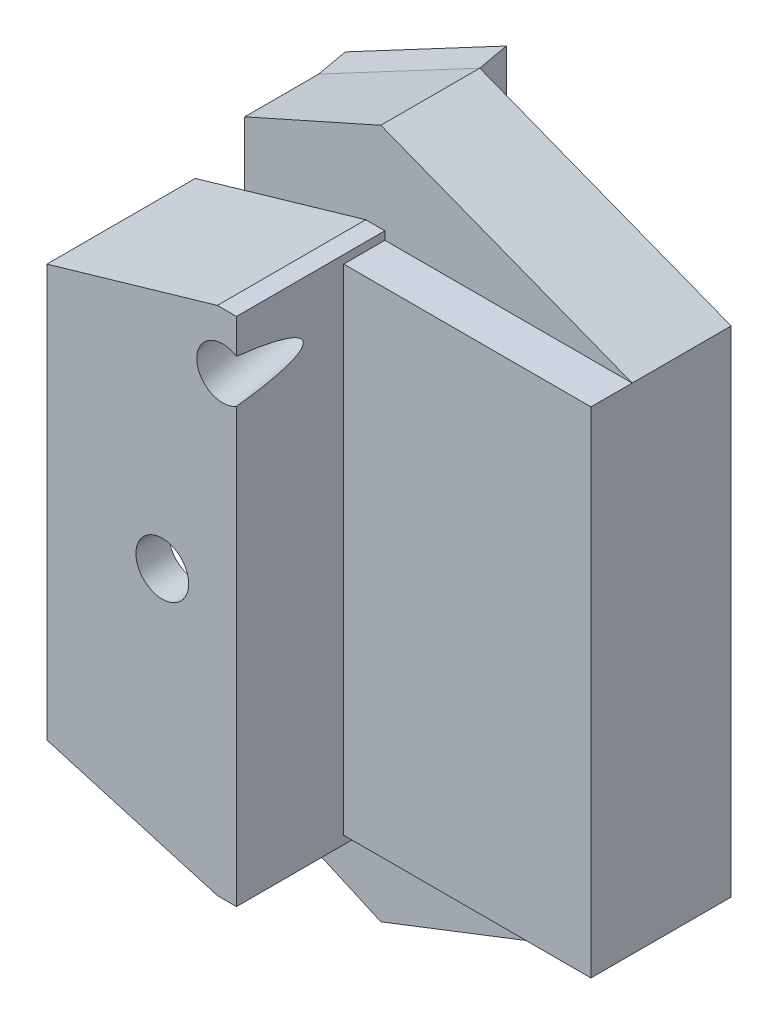
ISO-10303-21;
HEADER;
FILE_DESCRIPTION(('STEP AP214'),'2;1');
FILE_NAME('part.step','',(''),(''),'','','');
FILE_SCHEMA(('AUTOMOTIVE_DESIGN { 1 0 10303 214 1 1 1 1 }'));
ENDSEC;
DATA;
#1=APPLICATION_CONTEXT('core data for automotive mechanical design processes');
#2=APPLICATION_PROTOCOL_DEFINITION('international standard','automotive_design',2000,#1);
#3=PRODUCT_CONTEXT('',#1,'mechanical');
#4=PRODUCT('Part','Part','',(#3));
#5=PRODUCT_RELATED_PRODUCT_CATEGORY('part','',(#4));
#6=PRODUCT_DEFINITION_FORMATION('','',#4);
#7=PRODUCT_DEFINITION_CONTEXT('part definition',#1,'design');
#8=PRODUCT_DEFINITION('design','',#6,#7);
#9=PRODUCT_DEFINITION_SHAPE('','',#8);
#10=(LENGTH_UNIT() NAMED_UNIT(*) SI_UNIT(.MILLI.,.METRE.));
#11=(NAMED_UNIT(*) PLANE_ANGLE_UNIT() SI_UNIT($,.RADIAN.));
#12=(NAMED_UNIT(*) SI_UNIT($,.STERADIAN.) SOLID_ANGLE_UNIT());
#13=UNCERTAINTY_MEASURE_WITH_UNIT(LENGTH_MEASURE(1.E-05),#10,'distance_accuracy_value','');
#14=(GEOMETRIC_REPRESENTATION_CONTEXT(3) GLOBAL_UNCERTAINTY_ASSIGNED_CONTEXT((#13)) GLOBAL_UNIT_ASSIGNED_CONTEXT((#10,
#11,#12)) REPRESENTATION_CONTEXT('',''));
#15=CARTESIAN_POINT('',(0.,0.,0.));
#16=DIRECTION('',(0.,0.,1.));
#17=DIRECTION('',(1.,0.,0.));
#18=AXIS2_PLACEMENT_3D('',#15,#16,#17);
#19=CARTESIAN_POINT('',(8.41131093273328,-25.,-12.3686324109378));
#20=DIRECTION('',(0.179747868143722,0.,0.98371271410803));
#21=DIRECTION('',(0.98371271410803,0.,-0.179747868143722));
#22=AXIS2_PLACEMENT_3D('',#19,#20,#21);
#23=PLANE('',#22);
#24=CARTESIAN_POINT('',(5.18708670659668,12.0906685350896,-11.7794894398714));
#25=DIRECTION('',(-0.179747868143722,0.,-0.98371271410803));
#26=DIRECTION('',(-0.98371271410803,0.,0.179747868143722));
#27=AXIS2_PLACEMENT_3D('',#24,#25,#26);
#28=CIRCLE('',#27,1.55);
#29=CARTESIAN_POINT('',(3.66233199972923,12.0906685350896,-11.5008802442486));
#30=VERTEX_POINT('',#29);
#31=EDGE_CURVE('E279',#30,#30,#28,.T.);
#32=ORIENTED_EDGE('',*,*,#31,.F.);
#33=EDGE_LOOP('',(#32));
#34=FACE_BOUND('',#33,.T.);
#35=DIRECTION('',(0.98371271410803,0.,-0.179747868143722));
#36=VECTOR('',#35,1.);
#37=CARTESIAN_POINT('',(8.41131093273328,-16.9202707483122,-12.3686324109378));
#38=LINE('',#37,#36);
#39=CARTESIAN_POINT('',(0.155437314128315,-16.9202707483122,-10.8600866116149));
#40=VERTEX_POINT('',#39);
#41=CARTESIAN_POINT('',(8.41131093273328,-16.9202707483122,-12.3686324109378));
#42=VERTEX_POINT('',#41);
#43=EDGE_CURVE('E465',#40,#42,#38,.T.);
#44=ORIENTED_EDGE('',*,*,#43,.F.);
#45=DIRECTION('',(0.,1.,0.));
#46=VECTOR('',#45,1.);
#47=CARTESIAN_POINT('',(0.155437314128316,-25.,-10.8600866116149));
#48=LINE('',#47,#46);
#49=CARTESIAN_POINT('',(0.155437314128316,-9.66570656947852,-10.8600866116149));
#50=VERTEX_POINT('',#49);
#51=EDGE_CURVE('E291',#40,#50,#48,.T.);
#52=ORIENTED_EDGE('',*,*,#51,.T.);
#53=DIRECTION('',(-0.98371271410803,0.,0.179747868143722));
#54=VECTOR('',#53,1.);
#55=CARTESIAN_POINT('',(4.89735028479047,-9.66570656947851,-11.7265476577877));
#56=LINE('',#55,#54);
#57=CARTESIAN_POINT('',(7.15543731412832,-9.66570656947851,-12.1391542285735));
#58=VERTEX_POINT('',#57);
#59=EDGE_CURVE('E314',#58,#50,#56,.T.);
#60=ORIENTED_EDGE('',*,*,#59,.F.);
#61=DIRECTION('',(0.,-1.,0.));
#62=VECTOR('',#61,1.);
#63=CARTESIAN_POINT('',(7.15543731412832,0.,-12.1391542285735));
#64=LINE('',#63,#62);
#65=CARTESIAN_POINT('',(7.15543731412832,9.66570656947852,-12.1391542285735));
#66=VERTEX_POINT('',#65);
#67=EDGE_CURVE('E317',#66,#58,#64,.T.);
#68=ORIENTED_EDGE('',*,*,#67,.F.);
#69=DIRECTION('',(0.98371271410803,0.,-0.179747868143722));
#70=VECTOR('',#69,1.);
#71=CARTESIAN_POINT('',(7.00050531863838,9.66570656947852,-12.1108444431075));
#72=LINE('',#71,#70);
#73=CARTESIAN_POINT('',(0.155437314128316,9.66570656947852,-10.8600866116149));
#74=VERTEX_POINT('',#73);
#75=EDGE_CURVE('E320',#74,#66,#72,.T.);
#76=ORIENTED_EDGE('',*,*,#75,.F.);
#77=CARTESIAN_POINT('',(0.155437314128315,16.9202707483122,-10.8600866116149));
#78=VERTEX_POINT('',#77);
#79=EDGE_CURVE('E289',#74,#78,#48,.T.);
#80=ORIENTED_EDGE('',*,*,#79,.T.);
#81=DIRECTION('',(-0.98371271410803,0.,0.179747868143722));
#82=VECTOR('',#81,1.);
#83=CARTESIAN_POINT('',(8.41131093273328,16.9202707483122,-12.3686324109378));
#84=LINE('',#83,#82);
#85=CARTESIAN_POINT('',(8.41131093273328,16.9202707483122,-12.3686324109378));
#86=VERTEX_POINT('',#85);
#87=EDGE_CURVE('E55',#86,#78,#84,.T.);
#88=ORIENTED_EDGE('',*,*,#87,.F.);
#89=DIRECTION('',(0.,-1.,0.));
#90=VECTOR('',#89,1.);
#91=CARTESIAN_POINT('',(8.41131093273328,0.,-12.3686324109378));
#92=LINE('',#91,#90);
#93=EDGE_CURVE('E41',#86,#42,#92,.T.);
#94=ORIENTED_EDGE('',*,*,#93,.T.);
#95=EDGE_LOOP('',(#44,#52,#60,#68,#76,#80,#88,#94));
#96=FACE_BOUND('',#95,.T.);
#97=ADVANCED_FACE('F33',(#34,#96),#23,.F.);
#98=CARTESIAN_POINT('',(8.65543731412832,15.5,2.6313675890622));
#99=DIRECTION('',(0.,0.,-1.));
#100=DIRECTION('',(-1.,0.,0.));
#101=AXIS2_PLACEMENT_3D('',#98,#99,#100);
#102=PLANE('',#101);
#103=CARTESIAN_POINT('',(4.15543731412832,0.,2.6313675890622));
#104=DIRECTION('',(0.,0.,-1.));
#105=DIRECTION('',(-1.,0.,0.));
#106=AXIS2_PLACEMENT_3D('',#103,#104,#105);
#107=CIRCLE('',#106,1.6);
#108=CARTESIAN_POINT('',(2.55543731412832,0.,2.6313675890622));
#109=VERTEX_POINT('',#108);
#110=EDGE_CURVE('E386',#109,#109,#107,.T.);
#111=ORIENTED_EDGE('',*,*,#110,.T.);
#112=EDGE_LOOP('',(#111));
#113=FACE_BOUND('',#112,.T.);
#114=DIRECTION('',(0.,-1.,0.));
#115=VECTOR('',#114,1.);
#116=CARTESIAN_POINT('',(8.65543731412832,15.5,2.6313675890622));
#117=LINE('',#116,#115);
#118=CARTESIAN_POINT('',(8.65543731412832,10.776297041997,2.6313675890622));
#119=VERTEX_POINT('',#118);
#120=CARTESIAN_POINT('',(8.65543731412832,-15.5,2.6313675890622));
#121=VERTEX_POINT('',#120);
#122=EDGE_CURVE('E453',#119,#121,#117,.T.);
#123=ORIENTED_EDGE('',*,*,#122,.F.);
#124=CARTESIAN_POINT('',(7.8202953577866,12.0906685350896,2.6313675890622));
#125=DIRECTION('',(0.,0.,-1.));
#126=DIRECTION('',(-1.,0.,0.));
#127=AXIS2_PLACEMENT_3D('',#124,#125,#126);
#128=ELLIPSE('',#127,1.57566327828287,1.55);
#129=CARTESIAN_POINT('',(8.65543731412832,13.4050400281822,2.6313675890622));
#130=VERTEX_POINT('',#129);
#131=EDGE_CURVE('E285',#119,#130,#128,.T.);
#132=ORIENTED_EDGE('',*,*,#131,.T.);
#133=CARTESIAN_POINT('',(8.65543731412832,15.5,2.6313675890622));
#134=VERTEX_POINT('',#133);
#135=EDGE_CURVE('E454',#134,#130,#117,.T.);
#136=ORIENTED_EDGE('',*,*,#135,.F.);
#137=DIRECTION('',(1.,0.,0.));
#138=VECTOR('',#137,1.);
#139=CARTESIAN_POINT('',(8.65543731412832,15.5,2.6313675890622));
#140=LINE('',#139,#138);
#141=CARTESIAN_POINT('',(7.49637460625385,15.5,2.6313675890622));
#142=VERTEX_POINT('',#141);
#143=EDGE_CURVE('E431',#142,#134,#140,.T.);
#144=ORIENTED_EDGE('',*,*,#143,.F.);
#145=DIRECTION('',(0.96040110528823,0.278621099274887,0.));
#146=VECTOR('',#145,1.);
#147=CARTESIAN_POINT('',(-2.84456268587168,12.5,2.6313675890622));
#148=LINE('',#147,#146);
#149=CARTESIAN_POINT('',(-2.84456268587168,12.5,2.6313675890622));
#150=VERTEX_POINT('',#149);
#151=EDGE_CURVE('E412',#150,#142,#148,.T.);
#152=ORIENTED_EDGE('',*,*,#151,.F.);
#153=DIRECTION('',(0.,-1.,0.));
#154=VECTOR('',#153,1.);
#155=CARTESIAN_POINT('',(-2.84456268587168,15.5,2.6313675890622));
#156=LINE('',#155,#154);
#157=CARTESIAN_POINT('',(-2.84456268587168,-12.5,2.6313675890622));
#158=VERTEX_POINT('',#157);
#159=EDGE_CURVE('E440',#150,#158,#156,.T.);
#160=ORIENTED_EDGE('',*,*,#159,.T.);
#161=DIRECTION('',(-0.96040110528823,0.278621099274887,0.));
#162=VECTOR('',#161,1.);
#163=CARTESIAN_POINT('',(-2.84456268587168,-12.5,2.6313675890622));
#164=LINE('',#163,#162);
#165=CARTESIAN_POINT('',(7.49637460625385,-15.5,2.6313675890622));
#166=VERTEX_POINT('',#165);
#167=EDGE_CURVE('E424',#166,#158,#164,.T.);
#168=ORIENTED_EDGE('',*,*,#167,.F.);
#169=DIRECTION('',(1.,0.,0.));
#170=VECTOR('',#169,1.);
#171=CARTESIAN_POINT('',(8.65543731412832,-15.5,2.6313675890622));
#172=LINE('',#171,#170);
#173=EDGE_CURVE('E419',#166,#121,#172,.T.);
#174=ORIENTED_EDGE('',*,*,#173,.T.);
#175=EDGE_LOOP('',(#123,#132,#136,#144,#152,#160,#168,#174));
#176=FACE_BOUND('',#175,.T.);
#177=ADVANCED_FACE('F35',(#113,#176),#102,.F.);
#178=CARTESIAN_POINT('',(8.65543731412832,15.5,-6.3686324109378));
#179=DIRECTION('',(-1.,0.,0.));
#180=DIRECTION('',(0.,0.,1.));
#181=AXIS2_PLACEMENT_3D('',#178,#179,#180);
#182=PLANE('',#181);
#183=ORIENTED_EDGE('',*,*,#135,.T.);
#184=CARTESIAN_POINT('',(8.65543731412832,12.0906685350896,7.201879434474));
#185=DIRECTION('',(-1.,0.,0.));
#186=DIRECTION('',(0.,0.,-1.));
#187=AXIS2_PLACEMENT_3D('',#184,#185,#186);
#188=ELLIPSE('',#187,8.62318989374973,1.55);
#189=EDGE_CURVE('E282',#130,#119,#188,.T.);
#190=ORIENTED_EDGE('',*,*,#189,.T.);
#191=ORIENTED_EDGE('',*,*,#122,.T.);
#192=DIRECTION('',(0.,0.,-1.));
#193=VECTOR('',#192,1.);
#194=CARTESIAN_POINT('',(8.65543731412832,-15.5,-6.3686324109378));
#195=LINE('',#194,#193);
#196=CARTESIAN_POINT('',(8.65543731412832,-15.5,-6.3686324109378));
#197=VERTEX_POINT('',#196);
#198=EDGE_CURVE('E443',#121,#197,#195,.T.);
#199=ORIENTED_EDGE('',*,*,#198,.T.);
#200=DIRECTION('',(0.,-1.,0.));
#201=VECTOR('',#200,1.);
#202=CARTESIAN_POINT('',(8.65543731412832,15.5,-6.3686324109378));
#203=LINE('',#202,#201);
#204=CARTESIAN_POINT('',(8.65543731412832,-15.,-6.3686324109378));
#205=VERTEX_POINT('',#204);
#206=EDGE_CURVE('E450',#205,#197,#203,.T.);
#207=ORIENTED_EDGE('',*,*,#206,.F.);
#208=DIRECTION('',(0.,0.,1.));
#209=VECTOR('',#208,1.);
#210=CARTESIAN_POINT('',(8.65543731412832,-15.,-6.3686324109378));
#211=LINE('',#210,#209);
#212=CARTESIAN_POINT('',(8.65543731412832,-15.,-3.8686324109378));
#213=VERTEX_POINT('',#212);
#214=EDGE_CURVE('E357',#205,#213,#211,.T.);
#215=ORIENTED_EDGE('',*,*,#214,.T.);
#216=DIRECTION('',(0.,-1.,0.));
#217=VECTOR('',#216,1.);
#218=CARTESIAN_POINT('',(8.65543731412832,15.,-3.8686324109378));
#219=LINE('',#218,#217);
#220=CARTESIAN_POINT('',(8.65543731412832,15.,-3.8686324109378));
#221=VERTEX_POINT('',#220);
#222=EDGE_CURVE('E380',#221,#213,#219,.T.);
#223=ORIENTED_EDGE('',*,*,#222,.F.);
#224=DIRECTION('',(0.,0.,1.));
#225=VECTOR('',#224,1.);
#226=CARTESIAN_POINT('',(8.65543731412832,15.,-6.3686324109378));
#227=LINE('',#226,#225);
#228=CARTESIAN_POINT('',(8.65543731412832,15.,-6.3686324109378));
#229=VERTEX_POINT('',#228);
#230=EDGE_CURVE('E358',#229,#221,#227,.T.);
#231=ORIENTED_EDGE('',*,*,#230,.F.);
#232=CARTESIAN_POINT('',(8.65543731412832,15.5,-6.3686324109378));
#233=VERTEX_POINT('',#232);
#234=EDGE_CURVE('E451',#233,#229,#203,.T.);
#235=ORIENTED_EDGE('',*,*,#234,.F.);
#236=DIRECTION('',(0.,0.,-1.));
#237=VECTOR('',#236,1.);
#238=CARTESIAN_POINT('',(8.65543731412832,15.5,-6.3686324109378));
#239=LINE('',#238,#237);
#240=EDGE_CURVE('E433',#134,#233,#239,.T.);
#241=ORIENTED_EDGE('',*,*,#240,.F.);
#242=EDGE_LOOP('',(#183,#190,#191,#199,#207,#215,#223,#231,#235,#241));
#243=FACE_BOUND('',#242,.T.);
#244=ADVANCED_FACE('F494',(#243),#182,.F.);
#245=CARTESIAN_POINT('',(-2.84456268587168,15.5,2.6313675890622));
#246=DIRECTION('',(1.,0.,0.));
#247=DIRECTION('',(0.,0.,-1.));
#248=AXIS2_PLACEMENT_3D('',#245,#246,#247);
#249=PLANE('',#248);
#250=DIRECTION('',(0.,0.,1.));
#251=VECTOR('',#250,1.);
#252=CARTESIAN_POINT('',(-2.84456268587168,12.5,-6.3696324109378));
#253=LINE('',#252,#251);
#254=CARTESIAN_POINT('',(-2.84456268587168,12.5,-6.3686324109378));
#255=VERTEX_POINT('',#254);
#256=EDGE_CURVE('E415',#255,#150,#253,.T.);
#257=ORIENTED_EDGE('',*,*,#256,.F.);
#258=DIRECTION('',(0.,1.,0.));
#259=VECTOR('',#258,1.);
#260=CARTESIAN_POINT('',(-2.84456268587168,-25.,-6.3686324109378));
#261=LINE('',#260,#259);
#262=CARTESIAN_POINT('',(-2.84456268587168,9.66570656947852,-6.3686324109378));
#263=VERTEX_POINT('',#262);
#264=EDGE_CURVE('E288',#263,#255,#261,.T.);
#265=ORIENTED_EDGE('',*,*,#264,.F.);
#266=DIRECTION('',(0.,0.,-1.));
#267=VECTOR('',#266,1.);
#268=CARTESIAN_POINT('',(-2.84456268587168,9.66570656947852,-11.2629424604052));
#269=LINE('',#268,#267);
#270=CARTESIAN_POINT('',(-2.84456268587168,9.66570656947852,0.631367589062198));
#271=VERTEX_POINT('',#270);
#272=EDGE_CURVE('E393',#271,#263,#269,.T.);
#273=ORIENTED_EDGE('',*,*,#272,.F.);
#274=DIRECTION('',(0.,1.,0.));
#275=VECTOR('',#274,1.);
#276=CARTESIAN_POINT('',(-2.84456268587168,9.66570656947852,0.631367589062198));
#277=LINE('',#276,#275);
#278=CARTESIAN_POINT('',(-2.84456268587168,-9.66570656947852,0.6313675890622));
#279=VERTEX_POINT('',#278);
#280=EDGE_CURVE('E389',#279,#271,#277,.T.);
#281=ORIENTED_EDGE('',*,*,#280,.F.);
#282=DIRECTION('',(0.,0.,-1.));
#283=VECTOR('',#282,1.);
#284=CARTESIAN_POINT('',(-2.84456268587168,-9.66570656947852,2.63136758906219));
#285=LINE('',#284,#283);
#286=CARTESIAN_POINT('',(-2.84456268587168,-9.66570656947852,-6.3686324109378));
#287=VERTEX_POINT('',#286);
#288=EDGE_CURVE('E457',#279,#287,#285,.T.);
#289=ORIENTED_EDGE('',*,*,#288,.T.);
#290=CARTESIAN_POINT('',(-2.84456268587168,-12.5,-6.3686324109378));
#291=VERTEX_POINT('',#290);
#292=EDGE_CURVE('E297',#291,#287,#261,.T.);
#293=ORIENTED_EDGE('',*,*,#292,.F.);
#294=DIRECTION('',(0.,0.,1.));
#295=VECTOR('',#294,1.);
#296=CARTESIAN_POINT('',(-2.84456268587168,-12.5,-6.3696324109378));
#297=LINE('',#296,#295);
#298=EDGE_CURVE('E426',#291,#158,#297,.T.);
#299=ORIENTED_EDGE('',*,*,#298,.T.);
#300=ORIENTED_EDGE('',*,*,#159,.F.);
#301=EDGE_LOOP('',(#257,#265,#273,#281,#289,#293,#299,#300));
#302=FACE_BOUND('',#301,.T.);
#303=ADVANCED_FACE('F581',(#302),#249,.F.);
#304=CARTESIAN_POINT('',(0.,15.5,0.));
#305=DIRECTION('',(0.,-1.,0.));
#306=DIRECTION('',(0.,0.,-1.));
#307=AXIS2_PLACEMENT_3D('',#304,#305,#306);
#308=PLANE('',#307);
#309=DIRECTION('',(-1.,0.,0.));
#310=VECTOR('',#309,1.);
#311=CARTESIAN_POINT('',(-2.84456268587168,15.5,-6.3686324109378));
#312=LINE('',#311,#310);
#313=CARTESIAN_POINT('',(7.49637460625385,15.5,-6.3686324109378));
#314=VERTEX_POINT('',#313);
#315=EDGE_CURVE('E437',#233,#314,#312,.T.);
#316=ORIENTED_EDGE('',*,*,#315,.T.);
#317=DIRECTION('',(0.,0.,1.));
#318=VECTOR('',#317,1.);
#319=CARTESIAN_POINT('',(7.49637460625385,15.5,-6.3696324109378));
#320=LINE('',#319,#318);
#321=EDGE_CURVE('E416',#314,#142,#320,.T.);
#322=ORIENTED_EDGE('',*,*,#321,.T.);
#323=ORIENTED_EDGE('',*,*,#143,.T.);
#324=ORIENTED_EDGE('',*,*,#240,.T.);
#325=EDGE_LOOP('',(#316,#322,#323,#324));
#326=FACE_BOUND('',#325,.T.);
#327=ADVANCED_FACE('F578',(#326),#308,.F.);
#328=CARTESIAN_POINT('',(0.,-15.5,0.));
#329=DIRECTION('',(0.,-1.,0.));
#330=DIRECTION('',(0.,0.,-1.));
#331=AXIS2_PLACEMENT_3D('',#328,#329,#330);
#332=PLANE('',#331);
#333=DIRECTION('',(0.,0.,1.));
#334=VECTOR('',#333,1.);
#335=CARTESIAN_POINT('',(7.49637460625385,-15.5,-6.3696324109378));
#336=LINE('',#335,#334);
#337=CARTESIAN_POINT('',(7.49637460625385,-15.5,-6.3686324109378));
#338=VERTEX_POINT('',#337);
#339=EDGE_CURVE('E427',#338,#166,#336,.T.);
#340=ORIENTED_EDGE('',*,*,#339,.F.);
#341=DIRECTION('',(-1.,0.,0.));
#342=VECTOR('',#341,1.);
#343=CARTESIAN_POINT('',(-2.84456268587168,-15.5,-6.3686324109378));
#344=LINE('',#343,#342);
#345=EDGE_CURVE('E434',#197,#338,#344,.T.);
#346=ORIENTED_EDGE('',*,*,#345,.F.);
#347=ORIENTED_EDGE('',*,*,#198,.F.);
#348=ORIENTED_EDGE('',*,*,#173,.F.);
#349=EDGE_LOOP('',(#340,#346,#347,#348));
#350=FACE_BOUND('',#349,.T.);
#351=ADVANCED_FACE('F576',(#350),#332,.T.);
#352=CARTESIAN_POINT('',(-2.84456268587168,-12.5,-6.3696324109378));
#353=DIRECTION('',(0.278621099274887,0.96040110528823,0.));
#354=DIRECTION('',(-0.96040110528823,0.278621099274887,0.));
#355=AXIS2_PLACEMENT_3D('',#352,#353,#354);
#356=PLANE('',#355);
#357=DIRECTION('',(0.96040110528823,-0.278621099274887,0.));
#358=VECTOR('',#357,1.);
#359=CARTESIAN_POINT('',(-2.84456268587168,-12.5,-6.3686324109378));
#360=LINE('',#359,#358);
#361=CARTESIAN_POINT('',(0.155437314128316,-13.3703272968161,-6.3686324109378));
#362=VERTEX_POINT('',#361);
#363=EDGE_CURVE('E421',#291,#362,#360,.T.);
#364=ORIENTED_EDGE('',*,*,#363,.T.);
#365=EDGE_CURVE('E406',#362,#338,#360,.T.);
#366=ORIENTED_EDGE('',*,*,#365,.T.);
#367=ORIENTED_EDGE('',*,*,#339,.T.);
#368=ORIENTED_EDGE('',*,*,#167,.T.);
#369=ORIENTED_EDGE('',*,*,#298,.F.);
#370=EDGE_LOOP('',(#364,#366,#367,#368,#369));
#371=FACE_BOUND('',#370,.T.);
#372=ADVANCED_FACE('F572',(#371),#356,.F.);
#373=CARTESIAN_POINT('',(-2.84456268587168,12.5,-6.3696324109378));
#374=DIRECTION('',(0.278621099274887,-0.96040110528823,0.));
#375=DIRECTION('',(0.96040110528823,0.278621099274887,0.));
#376=AXIS2_PLACEMENT_3D('',#373,#374,#375);
#377=PLANE('',#376);
#378=DIRECTION('',(-0.96040110528823,-0.278621099274887,0.));
#379=VECTOR('',#378,1.);
#380=CARTESIAN_POINT('',(-2.84456268587168,12.5,-6.3686324109378));
#381=LINE('',#380,#379);
#382=CARTESIAN_POINT('',(0.155437314128316,13.3703272968161,-6.3686324109378));
#383=VERTEX_POINT('',#382);
#384=EDGE_CURVE('E409',#314,#383,#381,.T.);
#385=ORIENTED_EDGE('',*,*,#384,.T.);
#386=EDGE_CURVE('E413',#383,#255,#381,.T.);
#387=ORIENTED_EDGE('',*,*,#386,.T.);
#388=ORIENTED_EDGE('',*,*,#256,.T.);
#389=ORIENTED_EDGE('',*,*,#151,.T.);
#390=ORIENTED_EDGE('',*,*,#321,.F.);
#391=EDGE_LOOP('',(#385,#387,#388,#389,#390));
#392=FACE_BOUND('',#391,.T.);
#393=ADVANCED_FACE('F558',(#392),#377,.F.);
#394=CARTESIAN_POINT('',(7.15543731412832,0.,0.));
#395=DIRECTION('',(1.,0.,0.));
#396=DIRECTION('',(0.,0.,-1.));
#397=AXIS2_PLACEMENT_3D('',#394,#395,#396);
#398=PLANE('',#397);
#399=DIRECTION('',(0.,0.,-1.));
#400=VECTOR('',#399,1.);
#401=CARTESIAN_POINT('',(7.15543731412832,9.66570656947852,0.631367589062198));
#402=LINE('',#401,#400);
#403=CARTESIAN_POINT('',(7.15543731412832,9.66570656947852,0.631367589062198));
#404=VERTEX_POINT('',#403);
#405=EDGE_CURVE('E396',#404,#66,#402,.T.);
#406=ORIENTED_EDGE('',*,*,#405,.T.);
#407=ORIENTED_EDGE('',*,*,#67,.T.);
#408=DIRECTION('',(0.,0.,1.));
#409=VECTOR('',#408,1.);
#410=CARTESIAN_POINT('',(7.15543731412832,-9.66570656947852,-6.3686324109378));
#411=LINE('',#410,#409);
#412=CARTESIAN_POINT('',(7.15543731412832,-9.66570656947852,0.6313675890622));
#413=VERTEX_POINT('',#412);
#414=EDGE_CURVE('E390',#58,#413,#411,.T.);
#415=ORIENTED_EDGE('',*,*,#414,.T.);
#416=DIRECTION('',(0.,1.,0.));
#417=VECTOR('',#416,1.);
#418=CARTESIAN_POINT('',(7.15543731412832,9.66570656947852,0.631367589062198));
#419=LINE('',#418,#417);
#420=EDGE_CURVE('E392',#413,#404,#419,.T.);
#421=ORIENTED_EDGE('',*,*,#420,.T.);
#422=EDGE_LOOP('',(#406,#407,#415,#421));
#423=FACE_BOUND('',#422,.T.);
#424=ADVANCED_FACE('F554',(#423),#398,.F.);
#425=CARTESIAN_POINT('',(7.15543731412832,9.66570656947852,-11.2629424604052));
#426=DIRECTION('',(0.,1.,0.));
#427=DIRECTION('',(0.,0.,1.));
#428=AXIS2_PLACEMENT_3D('',#425,#426,#427);
#429=PLANE('',#428);
#430=DIRECTION('',(0.,0.,-1.));
#431=VECTOR('',#430,1.);
#432=CARTESIAN_POINT('',(0.155437314128316,9.66570656947852,-11.2629424604052));
#433=LINE('',#432,#431);
#434=CARTESIAN_POINT('',(0.155437314128316,9.66570656947852,-6.3686324109378));
#435=VERTEX_POINT('',#434);
#436=EDGE_CURVE('E307',#435,#74,#433,.T.);
#437=ORIENTED_EDGE('',*,*,#436,.T.);
#438=ORIENTED_EDGE('',*,*,#75,.T.);
#439=ORIENTED_EDGE('',*,*,#405,.F.);
#440=DIRECTION('',(-1.,0.,0.));
#441=VECTOR('',#440,1.);
#442=CARTESIAN_POINT('',(7.15543731412832,9.66570656947852,0.631367589062198));
#443=LINE('',#442,#441);
#444=EDGE_CURVE('E404',#404,#271,#443,.T.);
#445=ORIENTED_EDGE('',*,*,#444,.T.);
#446=ORIENTED_EDGE('',*,*,#272,.T.);
#447=DIRECTION('',(1.,0.,0.));
#448=VECTOR('',#447,1.);
#449=CARTESIAN_POINT('',(7.15543731412832,9.66570656947852,-6.3686324109378));
#450=LINE('',#449,#448);
#451=EDGE_CURVE('E326',#263,#435,#450,.T.);
#452=ORIENTED_EDGE('',*,*,#451,.T.);
#453=EDGE_LOOP('',(#437,#438,#439,#445,#446,#452));
#454=FACE_BOUND('',#453,.T.);
#455=ADVANCED_FACE('F557',(#454),#429,.F.);
#456=CARTESIAN_POINT('',(7.15543731412832,-9.66570656947852,0.6313675890622));
#457=DIRECTION('',(0.,-1.,0.));
#458=DIRECTION('',(0.,0.,-1.));
#459=AXIS2_PLACEMENT_3D('',#456,#457,#458);
#460=PLANE('',#459);
#461=ORIENTED_EDGE('',*,*,#414,.F.);
#462=ORIENTED_EDGE('',*,*,#59,.T.);
#463=DIRECTION('',(0.,0.,1.));
#464=VECTOR('',#463,1.);
#465=CARTESIAN_POINT('',(0.155437314128316,-9.66570656947852,0.6313675890622));
#466=LINE('',#465,#464);
#467=CARTESIAN_POINT('',(0.155437314128316,-9.66570656947852,-6.3686324109378));
#468=VERTEX_POINT('',#467);
#469=EDGE_CURVE('E304',#50,#468,#466,.T.);
#470=ORIENTED_EDGE('',*,*,#469,.T.);
#471=DIRECTION('',(-1.,0.,0.));
#472=VECTOR('',#471,1.);
#473=CARTESIAN_POINT('',(7.15543731412832,-9.66570656947852,-6.3686324109378));
#474=LINE('',#473,#472);
#475=EDGE_CURVE('E323',#468,#287,#474,.T.);
#476=ORIENTED_EDGE('',*,*,#475,.T.);
#477=ORIENTED_EDGE('',*,*,#288,.F.);
#478=DIRECTION('',(-1.,0.,0.));
#479=VECTOR('',#478,1.);
#480=CARTESIAN_POINT('',(7.15543731412832,-9.66570656947852,0.6313675890622));
#481=LINE('',#480,#479);
#482=EDGE_CURVE('E399',#413,#279,#481,.T.);
#483=ORIENTED_EDGE('',*,*,#482,.F.);
#484=EDGE_LOOP('',(#461,#462,#470,#476,#477,#483));
#485=FACE_BOUND('',#484,.T.);
#486=ADVANCED_FACE('F562',(#485),#460,.F.);
#487=CARTESIAN_POINT('',(7.15543731412832,9.66570656947852,0.631367589062198));
#488=DIRECTION('',(0.,0.,1.));
#489=DIRECTION('',(0.,-1.,0.));
#490=AXIS2_PLACEMENT_3D('',#487,#488,#489);
#491=PLANE('',#490);
#492=CARTESIAN_POINT('',(4.15543731412832,0.,0.631367589062199));
#493=DIRECTION('',(0.,0.,-1.));
#494=DIRECTION('',(0.,1.,0.));
#495=AXIS2_PLACEMENT_3D('',#492,#493,#494);
#496=CIRCLE('',#495,1.6);
#497=CARTESIAN_POINT('',(4.15543731412832,1.6,0.631367589062199));
#498=VERTEX_POINT('',#497);
#499=EDGE_CURVE('E383',#498,#498,#496,.T.);
#500=ORIENTED_EDGE('',*,*,#499,.F.);
#501=EDGE_LOOP('',(#500));
#502=FACE_BOUND('',#501,.T.);
#503=ORIENTED_EDGE('',*,*,#280,.T.);
#504=ORIENTED_EDGE('',*,*,#444,.F.);
#505=ORIENTED_EDGE('',*,*,#420,.F.);
#506=ORIENTED_EDGE('',*,*,#482,.T.);
#507=EDGE_LOOP('',(#503,#504,#505,#506));
#508=FACE_BOUND('',#507,.T.);
#509=ADVANCED_FACE('F552',(#502,#508),#491,.F.);
#510=CARTESIAN_POINT('',(4.15543731412832,0.,3.8313675890622));
#511=DIRECTION('',(0.,0.,-1.));
#512=DIRECTION('',(0.,1.,0.));
#513=AXIS2_PLACEMENT_3D('',#510,#511,#512);
#514=CYLINDRICAL_SURFACE('',#513,1.6);
#515=ORIENTED_EDGE('',*,*,#499,.T.);
#516=EDGE_LOOP('',(#515));
#517=FACE_BOUND('',#516,.T.);
#518=ORIENTED_EDGE('',*,*,#110,.F.);
#519=EDGE_LOOP('',(#518));
#520=FACE_BOUND('',#519,.T.);
#521=ADVANCED_FACE('F548',(#517,#520),#514,.F.);
#522=CARTESIAN_POINT('',(8.65543731412832,15.,-3.8686324109378));
#523=DIRECTION('',(0.,0.,-1.));
#524=DIRECTION('',(-1.,0.,0.));
#525=AXIS2_PLACEMENT_3D('',#522,#523,#524);
#526=PLANE('',#525);
#527=DIRECTION('',(1.,0.,0.));
#528=VECTOR('',#527,1.);
#529=CARTESIAN_POINT('',(8.65543731412832,-15.,-3.8686324109378));
#530=LINE('',#529,#528);
#531=CARTESIAN_POINT('',(23.6554373141283,-15.,-3.8686324109378));
#532=VERTEX_POINT('',#531);
#533=EDGE_CURVE('E372',#213,#532,#530,.T.);
#534=ORIENTED_EDGE('',*,*,#533,.T.);
#535=DIRECTION('',(0.,-1.,0.));
#536=VECTOR('',#535,1.);
#537=CARTESIAN_POINT('',(23.6554373141283,15.,-3.8686324109378));
#538=LINE('',#537,#536);
#539=CARTESIAN_POINT('',(23.6554373141283,15.,-3.8686324109378));
#540=VERTEX_POINT('',#539);
#541=EDGE_CURVE('E370',#540,#532,#538,.T.);
#542=ORIENTED_EDGE('',*,*,#541,.F.);
#543=DIRECTION('',(1.,0.,0.));
#544=VECTOR('',#543,1.);
#545=CARTESIAN_POINT('',(8.65543731412832,15.,-3.8686324109378));
#546=LINE('',#545,#544);
#547=EDGE_CURVE('E361',#221,#540,#546,.T.);
#548=ORIENTED_EDGE('',*,*,#547,.F.);
#549=ORIENTED_EDGE('',*,*,#222,.T.);
#550=EDGE_LOOP('',(#534,#542,#548,#549));
#551=FACE_BOUND('',#550,.T.);
#552=ADVANCED_FACE('F544',(#551),#526,.F.);
#553=CARTESIAN_POINT('',(23.6554373141283,15.,-6.3686324109378));
#554=DIRECTION('',(-1.,0.,0.));
#555=DIRECTION('',(0.,0.,1.));
#556=AXIS2_PLACEMENT_3D('',#553,#554,#555);
#557=PLANE('',#556);
#558=DIRECTION('',(0.,0.,-1.));
#559=VECTOR('',#558,1.);
#560=CARTESIAN_POINT('',(23.6554373141283,-15.,-6.3686324109378));
#561=LINE('',#560,#559);
#562=CARTESIAN_POINT('',(23.6554373141283,-15.,-6.3686324109378));
#563=VERTEX_POINT('',#562);
#564=EDGE_CURVE('E374',#532,#563,#561,.T.);
#565=ORIENTED_EDGE('',*,*,#564,.T.);
#566=DIRECTION('',(0.,0.,1.));
#567=VECTOR('',#566,1.);
#568=CARTESIAN_POINT('',(23.6554373141283,-15.,-12.3686324109378));
#569=LINE('',#568,#567);
#570=CARTESIAN_POINT('',(23.6554373141283,-15.,-12.3686324109378));
#571=VERTEX_POINT('',#570);
#572=EDGE_CURVE('E349',#571,#563,#569,.T.);
#573=ORIENTED_EDGE('',*,*,#572,.F.);
#574=DIRECTION('',(0.,-1.,0.));
#575=VECTOR('',#574,1.);
#576=CARTESIAN_POINT('',(23.6554373141283,15.,-12.3686324109378));
#577=LINE('',#576,#575);
#578=CARTESIAN_POINT('',(23.6554373141283,15.,-12.3686324109378));
#579=VERTEX_POINT('',#578);
#580=EDGE_CURVE('E332',#579,#571,#577,.T.);
#581=ORIENTED_EDGE('',*,*,#580,.F.);
#582=DIRECTION('',(0.,0.,1.));
#583=VECTOR('',#582,1.);
#584=CARTESIAN_POINT('',(23.6554373141283,15.,-12.3686324109378));
#585=LINE('',#584,#583);
#586=CARTESIAN_POINT('',(23.6554373141283,15.,-6.3686324109378));
#587=VERTEX_POINT('',#586);
#588=EDGE_CURVE('E351',#579,#587,#585,.T.);
#589=ORIENTED_EDGE('',*,*,#588,.T.);
#590=DIRECTION('',(0.,0.,-1.));
#591=VECTOR('',#590,1.);
#592=CARTESIAN_POINT('',(23.6554373141283,15.,-6.3686324109378));
#593=LINE('',#592,#591);
#594=EDGE_CURVE('E364',#540,#587,#593,.T.);
#595=ORIENTED_EDGE('',*,*,#594,.F.);
#596=ORIENTED_EDGE('',*,*,#541,.T.);
#597=EDGE_LOOP('',(#565,#573,#581,#589,#595,#596));
#598=FACE_BOUND('',#597,.T.);
#599=ADVANCED_FACE('F537',(#598),#557,.F.);
#600=CARTESIAN_POINT('',(0.,15.,0.));
#601=DIRECTION('',(0.,1.,0.));
#602=DIRECTION('',(0.,0.,1.));
#603=AXIS2_PLACEMENT_3D('',#600,#601,#602);
#604=PLANE('',#603);
#605=ORIENTED_EDGE('',*,*,#230,.T.);
#606=ORIENTED_EDGE('',*,*,#547,.T.);
#607=ORIENTED_EDGE('',*,*,#594,.T.);
#608=DIRECTION('',(-1.,0.,0.));
#609=VECTOR('',#608,1.);
#610=CARTESIAN_POINT('',(8.65543731412832,15.,-6.3686324109378));
#611=LINE('',#610,#609);
#612=EDGE_CURVE('E367',#587,#229,#611,.T.);
#613=ORIENTED_EDGE('',*,*,#612,.T.);
#614=EDGE_LOOP('',(#605,#606,#607,#613));
#615=FACE_BOUND('',#614,.T.);
#616=ADVANCED_FACE('F533',(#615),#604,.T.);
#617=CARTESIAN_POINT('',(0.,-15.,0.));
#618=DIRECTION('',(0.,1.,0.));
#619=DIRECTION('',(0.,0.,1.));
#620=AXIS2_PLACEMENT_3D('',#617,#618,#619);
#621=PLANE('',#620);
#622=ORIENTED_EDGE('',*,*,#214,.F.);
#623=DIRECTION('',(-1.,0.,0.));
#624=VECTOR('',#623,1.);
#625=CARTESIAN_POINT('',(8.65543731412832,-15.,-6.3686324109378));
#626=LINE('',#625,#624);
#627=EDGE_CURVE('E362',#563,#205,#626,.T.);
#628=ORIENTED_EDGE('',*,*,#627,.F.);
#629=ORIENTED_EDGE('',*,*,#564,.F.);
#630=ORIENTED_EDGE('',*,*,#533,.F.);
#631=EDGE_LOOP('',(#622,#628,#629,#630));
#632=FACE_BOUND('',#631,.T.);
#633=ADVANCED_FACE('F536',(#632),#621,.F.);
#634=CARTESIAN_POINT('',(0.,0.,-6.3686324109378));
#635=DIRECTION('',(0.,0.,-1.));
#636=DIRECTION('',(-1.,0.,0.));
#637=AXIS2_PLACEMENT_3D('',#634,#635,#636);
#638=PLANE('',#637);
#639=ORIENTED_EDGE('',*,*,#365,.F.);
#640=DIRECTION('',(0.,1.,0.));
#641=VECTOR('',#640,1.);
#642=CARTESIAN_POINT('',(0.155437314128316,-25.,-6.3686324109378));
#643=LINE('',#642,#641);
#644=CARTESIAN_POINT('',(0.155437314128316,-17.2368618204881,-6.3686324109378));
#645=VERTEX_POINT('',#644);
#646=EDGE_CURVE('E292',#645,#362,#643,.T.);
#647=ORIENTED_EDGE('',*,*,#646,.F.);
#648=DIRECTION('',(0.913230460685685,-0.407443401806695,0.));
#649=VECTOR('',#648,1.);
#650=CARTESIAN_POINT('',(-2.84456268587168,-15.8983933198838,-6.3686324109378));
#651=LINE('',#650,#649);
#652=CARTESIAN_POINT('',(8.41131093273328,-20.9202707483122,-6.3686324109378));
#653=VERTEX_POINT('',#652);
#654=EDGE_CURVE('E333',#645,#653,#651,.T.);
#655=ORIENTED_EDGE('',*,*,#654,.T.);
#656=DIRECTION('',(0.932169838551162,0.362021259176171,0.));
#657=VECTOR('',#656,1.);
#658=CARTESIAN_POINT('',(8.41131093273328,-20.9202707483122,-6.3686324109378));
#659=LINE('',#658,#657);
#660=EDGE_CURVE('E343',#653,#563,#659,.T.);
#661=ORIENTED_EDGE('',*,*,#660,.T.);
#662=ORIENTED_EDGE('',*,*,#627,.T.);
#663=ORIENTED_EDGE('',*,*,#206,.T.);
#664=ORIENTED_EDGE('',*,*,#345,.T.);
#665=EDGE_LOOP('',(#639,#647,#655,#661,#662,#663,#664));
#666=FACE_BOUND('',#665,.T.);
#667=ADVANCED_FACE('F518',(#666),#638,.F.);
#668=CARTESIAN_POINT('',(-2.84456268587168,15.8983933198838,-12.3686324109378));
#669=DIRECTION('',(0.407443401806695,-0.913230460685685,0.));
#670=DIRECTION('',(0.913230460685685,0.407443401806695,0.));
#671=AXIS2_PLACEMENT_3D('',#668,#669,#670);
#672=PLANE('',#671);
#673=DIRECTION('',(0.,0.,1.));
#674=VECTOR('',#673,1.);
#675=CARTESIAN_POINT('',(8.41131093273328,20.9202707483122,-12.3686324109378));
#676=LINE('',#675,#674);
#677=CARTESIAN_POINT('',(8.41131093273328,20.9202707483122,-12.3686324109378));
#678=VERTEX_POINT('',#677);
#679=CARTESIAN_POINT('',(8.41131093273328,20.9202707483122,-6.3686324109378));
#680=VERTEX_POINT('',#679);
#681=EDGE_CURVE('E354',#678,#680,#676,.T.);
#682=ORIENTED_EDGE('',*,*,#681,.F.);
#683=DIRECTION('',(-0.900775394217409,-0.401886497093122,0.164593233842375));
#684=VECTOR('',#683,1.);
#685=CARTESIAN_POINT('',(-2.53963057201551,16.0344406629569,-10.3676331746618));
#686=LINE('',#685,#684);
#687=CARTESIAN_POINT('',(0.155437314128316,17.2368618204881,-10.8600866116149));
#688=VERTEX_POINT('',#687);
#689=EDGE_CURVE('E311',#678,#688,#686,.T.);
#690=ORIENTED_EDGE('',*,*,#689,.T.);
#691=DIRECTION('',(0.,0.,1.));
#692=VECTOR('',#691,1.);
#693=CARTESIAN_POINT('',(0.155437314128316,17.2368618204881,-12.3686324109378));
#694=LINE('',#693,#692);
#695=CARTESIAN_POINT('',(0.155437314128316,17.2368618204881,-6.3686324109378));
#696=VERTEX_POINT('',#695);
#697=EDGE_CURVE('E301',#688,#696,#694,.T.);
#698=ORIENTED_EDGE('',*,*,#697,.T.);
#699=DIRECTION('',(0.913230460685685,0.407443401806695,0.));
#700=VECTOR('',#699,1.);
#701=CARTESIAN_POINT('',(-2.84456268587168,15.8983933198838,-6.3686324109378));
#702=LINE('',#701,#700);
#703=EDGE_CURVE('E329',#696,#680,#702,.T.);
#704=ORIENTED_EDGE('',*,*,#703,.T.);
#705=EDGE_LOOP('',(#682,#690,#698,#704));
#706=FACE_BOUND('',#705,.T.);
#707=ADVANCED_FACE('F529',(#706),#672,.F.);
#708=CARTESIAN_POINT('',(8.41131093273328,20.9202707483122,-12.3686324109378));
#709=DIRECTION('',(-0.362021259176171,-0.932169838551162,0.));
#710=DIRECTION('',(0.932169838551162,-0.362021259176171,0.));
#711=AXIS2_PLACEMENT_3D('',#708,#709,#710);
#712=PLANE('',#711);
#713=DIRECTION('',(0.932169838551162,-0.362021259176171,0.));
#714=VECTOR('',#713,1.);
#715=CARTESIAN_POINT('',(8.41131093273328,20.9202707483122,-6.3686324109378));
#716=LINE('',#715,#714);
#717=EDGE_CURVE('E340',#680,#587,#716,.T.);
#718=ORIENTED_EDGE('',*,*,#717,.T.);
#719=ORIENTED_EDGE('',*,*,#588,.F.);
#720=DIRECTION('',(0.932169838551162,-0.362021259176171,0.));
#721=VECTOR('',#720,1.);
#722=CARTESIAN_POINT('',(8.41131093273328,20.9202707483122,-12.3686324109378));
#723=LINE('',#722,#721);
#724=EDGE_CURVE('E330',#678,#579,#723,.T.);
#725=ORIENTED_EDGE('',*,*,#724,.F.);
#726=ORIENTED_EDGE('',*,*,#681,.T.);
#727=EDGE_LOOP('',(#718,#719,#725,#726));
#728=FACE_BOUND('',#727,.T.);
#729=ADVANCED_FACE('F525',(#728),#712,.F.);
#730=CARTESIAN_POINT('',(8.41131093273328,-20.9202707483122,-12.3686324109378));
#731=DIRECTION('',(0.362021259176171,-0.932169838551162,0.));
#732=DIRECTION('',(0.932169838551162,0.362021259176171,0.));
#733=AXIS2_PLACEMENT_3D('',#730,#731,#732);
#734=PLANE('',#733);
#735=ORIENTED_EDGE('',*,*,#660,.F.);
#736=DIRECTION('',(0.,0.,1.));
#737=VECTOR('',#736,1.);
#738=CARTESIAN_POINT('',(8.41131093273328,-20.9202707483122,-12.3686324109378));
#739=LINE('',#738,#737);
#740=CARTESIAN_POINT('',(8.41131093273328,-20.9202707483122,-12.3686324109378));
#741=VERTEX_POINT('',#740);
#742=EDGE_CURVE('E338',#741,#653,#739,.T.);
#743=ORIENTED_EDGE('',*,*,#742,.F.);
#744=DIRECTION('',(0.932169838551162,0.362021259176171,0.));
#745=VECTOR('',#744,1.);
#746=CARTESIAN_POINT('',(8.41131093273328,-20.9202707483122,-12.3686324109378));
#747=LINE('',#746,#745);
#748=EDGE_CURVE('E335',#741,#571,#747,.T.);
#749=ORIENTED_EDGE('',*,*,#748,.T.);
#750=ORIENTED_EDGE('',*,*,#572,.T.);
#751=EDGE_LOOP('',(#735,#743,#749,#750));
#752=FACE_BOUND('',#751,.T.);
#753=ADVANCED_FACE('F521',(#752),#734,.T.);
#754=CARTESIAN_POINT('',(-2.84456268587168,-15.8983933198838,-12.3686324109378));
#755=DIRECTION('',(-0.407443401806695,-0.913230460685685,0.));
#756=DIRECTION('',(0.913230460685685,-0.407443401806695,0.));
#757=AXIS2_PLACEMENT_3D('',#754,#755,#756);
#758=PLANE('',#757);
#759=DIRECTION('',(-0.900775394217409,0.401886497093122,0.164593233842375));
#760=VECTOR('',#759,1.);
#761=CARTESIAN_POINT('',(-2.53963057201551,-16.0344406629569,-10.3676331746618));
#762=LINE('',#761,#760);
#763=CARTESIAN_POINT('',(0.155437314128316,-17.2368618204881,-10.8600866116149));
#764=VERTEX_POINT('',#763);
#765=EDGE_CURVE('E248',#741,#764,#762,.T.);
#766=ORIENTED_EDGE('',*,*,#765,.F.);
#767=ORIENTED_EDGE('',*,*,#742,.T.);
#768=ORIENTED_EDGE('',*,*,#654,.F.);
#769=DIRECTION('',(0.,0.,1.));
#770=VECTOR('',#769,1.);
#771=CARTESIAN_POINT('',(0.155437314128316,-17.2368618204881,-12.3686324109378));
#772=LINE('',#771,#770);
#773=EDGE_CURVE('E299',#764,#645,#772,.T.);
#774=ORIENTED_EDGE('',*,*,#773,.F.);
#775=EDGE_LOOP('',(#766,#767,#768,#774));
#776=FACE_BOUND('',#775,.T.);
#777=ADVANCED_FACE('F515',(#776),#758,.T.);
#778=CARTESIAN_POINT('',(0.,0.,-12.3686324109378));
#779=DIRECTION('',(0.,0.,-1.));
#780=DIRECTION('',(-1.,0.,0.));
#781=AXIS2_PLACEMENT_3D('',#778,#779,#780);
#782=PLANE('',#781);
#783=EDGE_CURVE('E11',#678,#86,#92,.T.);
#784=ORIENTED_EDGE('',*,*,#783,.F.);
#785=ORIENTED_EDGE('',*,*,#724,.T.);
#786=ORIENTED_EDGE('',*,*,#580,.T.);
#787=ORIENTED_EDGE('',*,*,#748,.F.);
#788=DIRECTION('',(0.,-1.,0.));
#789=VECTOR('',#788,1.);
#790=CARTESIAN_POINT('',(8.41131093273328,-20.9202707483122,-12.3686324109378));
#791=LINE('',#790,#789);
#792=EDGE_CURVE('E48',#42,#741,#791,.T.);
#793=ORIENTED_EDGE('',*,*,#792,.F.);
#794=ORIENTED_EDGE('',*,*,#93,.F.);
#795=EDGE_LOOP('',(#784,#785,#786,#787,#793,#794));
#796=FACE_BOUND('',#795,.T.);
#797=ADVANCED_FACE('F512',(#796),#782,.T.);
#798=ORIENTED_EDGE('',*,*,#703,.F.);
#799=DIRECTION('',(0.,-1.,0.));
#800=VECTOR('',#799,1.);
#801=CARTESIAN_POINT('',(0.155437314128316,0.,-6.3686324109378));
#802=LINE('',#801,#800);
#803=EDGE_CURVE('E459',#696,#383,#802,.T.);
#804=ORIENTED_EDGE('',*,*,#803,.T.);
#805=ORIENTED_EDGE('',*,*,#384,.F.);
#806=ORIENTED_EDGE('',*,*,#315,.F.);
#807=ORIENTED_EDGE('',*,*,#234,.T.);
#808=ORIENTED_EDGE('',*,*,#612,.F.);
#809=ORIENTED_EDGE('',*,*,#717,.F.);
#810=EDGE_LOOP('',(#798,#804,#805,#806,#807,#808,#809));
#811=FACE_BOUND('',#810,.T.);
#812=ADVANCED_FACE('F510',(#811),#638,.F.);
#813=CARTESIAN_POINT('',(-2.84456268587168,-25.,-6.3686324109378));
#814=DIRECTION('',(0.,0.,1.));
#815=DIRECTION('',(1.,0.,0.));
#816=AXIS2_PLACEMENT_3D('',#813,#814,#815);
#817=PLANE('',#816);
#818=ORIENTED_EDGE('',*,*,#292,.T.);
#819=ORIENTED_EDGE('',*,*,#475,.F.);
#820=EDGE_CURVE('E296',#362,#468,#643,.T.);
#821=ORIENTED_EDGE('',*,*,#820,.F.);
#822=ORIENTED_EDGE('',*,*,#363,.F.);
#823=EDGE_LOOP('',(#818,#819,#821,#822));
#824=FACE_BOUND('',#823,.T.);
#825=ADVANCED_FACE('F507',(#824),#817,.F.);
#826=EDGE_CURVE('E294',#435,#383,#643,.T.);
#827=ORIENTED_EDGE('',*,*,#826,.F.);
#828=ORIENTED_EDGE('',*,*,#451,.F.);
#829=ORIENTED_EDGE('',*,*,#264,.T.);
#830=ORIENTED_EDGE('',*,*,#386,.F.);
#831=EDGE_LOOP('',(#827,#828,#829,#830));
#832=FACE_BOUND('',#831,.T.);
#833=ADVANCED_FACE('F505',(#832),#817,.F.);
#834=CARTESIAN_POINT('',(0.155437314128316,-25.,-6.3686324109378));
#835=DIRECTION('',(1.,0.,0.));
#836=DIRECTION('',(0.,0.,-1.));
#837=AXIS2_PLACEMENT_3D('',#834,#835,#836);
#838=PLANE('',#837);
#839=ORIENTED_EDGE('',*,*,#826,.T.);
#840=ORIENTED_EDGE('',*,*,#803,.F.);
#841=ORIENTED_EDGE('',*,*,#697,.F.);
#842=DIRECTION('',(0.,1.,0.));
#843=VECTOR('',#842,1.);
#844=CARTESIAN_POINT('',(0.155437314128315,16.9202707483122,-10.8600866116149));
#845=LINE('',#844,#843);
#846=EDGE_CURVE('E250',#78,#688,#845,.T.);
#847=ORIENTED_EDGE('',*,*,#846,.F.);
#848=ORIENTED_EDGE('',*,*,#79,.F.);
#849=ORIENTED_EDGE('',*,*,#436,.F.);
#850=EDGE_LOOP('',(#839,#840,#841,#847,#848,#849));
#851=FACE_BOUND('',#850,.T.);
#852=ADVANCED_FACE('F501',(#851),#838,.F.);
#853=EDGE_CURVE('E293',#764,#40,#48,.T.);
#854=ORIENTED_EDGE('',*,*,#853,.F.);
#855=ORIENTED_EDGE('',*,*,#773,.T.);
#856=ORIENTED_EDGE('',*,*,#646,.T.);
#857=ORIENTED_EDGE('',*,*,#820,.T.);
#858=ORIENTED_EDGE('',*,*,#469,.F.);
#859=ORIENTED_EDGE('',*,*,#51,.F.);
#860=EDGE_LOOP('',(#854,#855,#856,#857,#858,#859));
#861=FACE_BOUND('',#860,.T.);
#862=ADVANCED_FACE('F504',(#861),#838,.F.);
#863=CARTESIAN_POINT('',(14.1744801137828,12.0906685350896,37.4061462655301));
#864=DIRECTION('',(-0.179747868143722,0.,-0.98371271410803));
#865=DIRECTION('',(-0.98371271410803,0.,0.179747868143722));
#866=AXIS2_PLACEMENT_3D('',#863,#864,#865);
#867=CYLINDRICAL_SURFACE('',#866,1.55);
#868=ORIENTED_EDGE('',*,*,#31,.T.);
#869=EDGE_LOOP('',(#868));
#870=FACE_BOUND('',#869,.T.);
#871=ORIENTED_EDGE('',*,*,#189,.F.);
#872=ORIENTED_EDGE('',*,*,#131,.F.);
#873=EDGE_LOOP('',(#871,#872));
#874=FACE_BOUND('',#873,.T.);
#875=ADVANCED_FACE('F499',(#870,#874),#867,.F.);
#876=CARTESIAN_POINT('',(-0.204058422159128,17.2368618204881,-12.8275120398309));
#877=DIRECTION('',(0.395340856818844,-0.915689490741387,-0.0722382410882368));
#878=DIRECTION('',(0.918088082674478,0.396376427718778,0.));
#879=AXIS2_PLACEMENT_3D('',#876,#877,#878);
#880=PLANE('',#879);
#881=ORIENTED_EDGE('',*,*,#689,.F.);
#882=DIRECTION('',(0.179747868143722,0.,0.98371271410803));
#883=VECTOR('',#882,1.);
#884=CARTESIAN_POINT('',(8.05181519644583,20.9202707483122,-14.3360578391539));
#885=LINE('',#884,#883);
#886=CARTESIAN_POINT('',(8.05181519644583,20.9202707483122,-14.3360578391539));
#887=VERTEX_POINT('',#886);
#888=EDGE_CURVE('E276',#887,#678,#885,.T.);
#889=ORIENTED_EDGE('',*,*,#888,.F.);
#890=DIRECTION('',(0.900775394217409,0.401886497093122,-0.164593233842375));
#891=VECTOR('',#890,1.);
#892=CARTESIAN_POINT('',(-0.204058422159128,17.2368618204881,-12.8275120398309));
#893=LINE('',#892,#891);
#894=CARTESIAN_POINT('',(-0.204058422159128,17.2368618204881,-12.8275120398309));
#895=VERTEX_POINT('',#894);
#896=EDGE_CURVE('E256',#895,#887,#893,.T.);
#897=ORIENTED_EDGE('',*,*,#896,.F.);
#898=DIRECTION('',(0.179747868143722,0.,0.98371271410803));
#899=VECTOR('',#898,1.);
#900=CARTESIAN_POINT('',(-0.204058422159128,17.2368618204881,-12.8275120398309));
#901=LINE('',#900,#899);
#902=EDGE_CURVE('E264',#895,#688,#901,.T.);
#903=ORIENTED_EDGE('',*,*,#902,.T.);
#904=EDGE_LOOP('',(#881,#889,#897,#903));
#905=FACE_BOUND('',#904,.T.);
#906=ADVANCED_FACE('F601',(#905),#880,.F.);
#907=CARTESIAN_POINT('',(8.05181519644583,20.9202707483122,-14.3360578391539));
#908=DIRECTION('',(-0.98371271410803,0.,0.179747868143722));
#909=DIRECTION('',(0.179747868143722,0.,0.98371271410803));
#910=AXIS2_PLACEMENT_3D('',#907,#908,#909);
#911=PLANE('',#910);
#912=ORIENTED_EDGE('',*,*,#783,.T.);
#913=DIRECTION('',(0.179747868143722,0.,0.98371271410803));
#914=VECTOR('',#913,1.);
#915=CARTESIAN_POINT('',(8.05181519644583,16.9202707483122,-14.3360578391539));
#916=LINE('',#915,#914);
#917=CARTESIAN_POINT('',(8.05181519644583,16.9202707483122,-14.3360578391539));
#918=VERTEX_POINT('',#917);
#919=EDGE_CURVE('E273',#918,#86,#916,.T.);
#920=ORIENTED_EDGE('',*,*,#919,.F.);
#921=DIRECTION('',(0.,-1.,0.));
#922=VECTOR('',#921,1.);
#923=CARTESIAN_POINT('',(8.05181519644583,20.9202707483122,-14.3360578391539));
#924=LINE('',#923,#922);
#925=EDGE_CURVE('E259',#887,#918,#924,.T.);
#926=ORIENTED_EDGE('',*,*,#925,.F.);
#927=ORIENTED_EDGE('',*,*,#888,.T.);
#928=EDGE_LOOP('',(#912,#920,#926,#927));
#929=FACE_BOUND('',#928,.T.);
#930=ADVANCED_FACE('F606',(#929),#911,.F.);
#931=CARTESIAN_POINT('',(8.05181519644583,16.9202707483122,-14.3360578391539));
#932=DIRECTION('',(0.,1.,0.));
#933=DIRECTION('',(0.,0.,1.));
#934=AXIS2_PLACEMENT_3D('',#931,#932,#933);
#935=PLANE('',#934);
#936=ORIENTED_EDGE('',*,*,#87,.T.);
#937=DIRECTION('',(0.179747868143722,0.,0.98371271410803));
#938=VECTOR('',#937,1.);
#939=CARTESIAN_POINT('',(-0.204058422159128,16.9202707483122,-12.8275120398309));
#940=LINE('',#939,#938);
#941=CARTESIAN_POINT('',(-0.204058422159128,16.9202707483122,-12.8275120398309));
#942=VERTEX_POINT('',#941);
#943=EDGE_CURVE('E270',#942,#78,#940,.T.);
#944=ORIENTED_EDGE('',*,*,#943,.F.);
#945=DIRECTION('',(-0.98371271410803,0.,0.179747868143722));
#946=VECTOR('',#945,1.);
#947=CARTESIAN_POINT('',(8.05181519644583,16.9202707483122,-14.3360578391539));
#948=LINE('',#947,#946);
#949=EDGE_CURVE('E261',#918,#942,#948,.T.);
#950=ORIENTED_EDGE('',*,*,#949,.F.);
#951=ORIENTED_EDGE('',*,*,#919,.T.);
#952=EDGE_LOOP('',(#936,#944,#950,#951));
#953=FACE_BOUND('',#952,.T.);
#954=ADVANCED_FACE('F633',(#953),#935,.F.);
#955=CARTESIAN_POINT('',(-0.204058422159128,16.9202707483122,-12.8275120398309));
#956=DIRECTION('',(0.98371271410803,0.,-0.179747868143722));
#957=DIRECTION('',(-0.179747868143722,0.,-0.98371271410803));
#958=AXIS2_PLACEMENT_3D('',#955,#956,#957);
#959=PLANE('',#958);
#960=ORIENTED_EDGE('',*,*,#846,.T.);
#961=ORIENTED_EDGE('',*,*,#902,.F.);
#962=DIRECTION('',(0.,1.,0.));
#963=VECTOR('',#962,1.);
#964=CARTESIAN_POINT('',(-0.204058422159128,16.9202707483122,-12.8275120398309));
#965=LINE('',#964,#963);
#966=EDGE_CURVE('E263',#942,#895,#965,.T.);
#967=ORIENTED_EDGE('',*,*,#966,.F.);
#968=ORIENTED_EDGE('',*,*,#943,.T.);
#969=EDGE_LOOP('',(#960,#961,#967,#968));
#970=FACE_BOUND('',#969,.T.);
#971=ADVANCED_FACE('F637',(#970),#959,.F.);
#972=CARTESIAN_POINT('',(-2.27475703941145,0.,-12.4491458190011));
#973=DIRECTION('',(-0.179747868143722,0.,-0.98371271410803));
#974=DIRECTION('',(-0.98371271410803,0.,0.179747868143722));
#975=AXIS2_PLACEMENT_3D('',#972,#973,#974);
#976=PLANE('',#975);
#977=ORIENTED_EDGE('',*,*,#896,.T.);
#978=ORIENTED_EDGE('',*,*,#925,.T.);
#979=ORIENTED_EDGE('',*,*,#949,.T.);
#980=ORIENTED_EDGE('',*,*,#966,.T.);
#981=EDGE_LOOP('',(#977,#978,#979,#980));
#982=FACE_BOUND('',#981,.T.);
#983=ADVANCED_FACE('F640',(#982),#976,.T.);
#984=CARTESIAN_POINT('',(-0.204058422159128,-17.2368618204881,-12.8275120398309));
#985=DIRECTION('',(0.395340856818844,0.915689490741387,-0.0722382410882368));
#986=DIRECTION('',(-0.918088082674478,0.396376427718778,0.));
#987=AXIS2_PLACEMENT_3D('',#984,#985,#986);
#988=PLANE('',#987);
#989=ORIENTED_EDGE('',*,*,#765,.T.);
#990=DIRECTION('',(0.179747868143722,0.,0.98371271410803));
#991=VECTOR('',#990,1.);
#992=CARTESIAN_POINT('',(-0.204058422159128,-17.2368618204881,-12.8275120398309));
#993=LINE('',#992,#991);
#994=CARTESIAN_POINT('',(-0.204058422159128,-17.2368618204881,-12.8275120398309));
#995=VERTEX_POINT('',#994);
#996=EDGE_CURVE('E230',#995,#764,#993,.T.);
#997=ORIENTED_EDGE('',*,*,#996,.F.);
#998=DIRECTION('',(-0.900775394217409,0.401886497093122,0.164593233842375));
#999=VECTOR('',#998,1.);
#1000=CARTESIAN_POINT('',(-0.204058422159128,-17.2368618204881,-12.8275120398309));
#1001=LINE('',#1000,#999);
#1002=CARTESIAN_POINT('',(8.05181519644583,-20.9202707483122,-14.3360578391539));
#1003=VERTEX_POINT('',#1002);
#1004=EDGE_CURVE('E237',#1003,#995,#1001,.T.);
#1005=ORIENTED_EDGE('',*,*,#1004,.F.);
#1006=DIRECTION('',(0.179747868143722,0.,0.98371271410803));
#1007=VECTOR('',#1006,1.);
#1008=CARTESIAN_POINT('',(8.05181519644583,-20.9202707483122,-14.3360578391539));
#1009=LINE('',#1008,#1007);
#1010=EDGE_CURVE('E473',#1003,#741,#1009,.T.);
#1011=ORIENTED_EDGE('',*,*,#1010,.T.);
#1012=EDGE_LOOP('',(#989,#997,#1005,#1011));
#1013=FACE_BOUND('',#1012,.T.);
#1014=ADVANCED_FACE('F247',(#1013),#988,.F.);
#1015=CARTESIAN_POINT('',(-0.204058422159128,-16.9202707483122,-12.8275120398309));
#1016=DIRECTION('',(0.98371271410803,0.,-0.179747868143722));
#1017=DIRECTION('',(-0.179747868143722,0.,-0.98371271410803));
#1018=AXIS2_PLACEMENT_3D('',#1015,#1016,#1017);
#1019=PLANE('',#1018);
#1020=ORIENTED_EDGE('',*,*,#853,.T.);
#1021=DIRECTION('',(0.179747868143722,0.,0.98371271410803));
#1022=VECTOR('',#1021,1.);
#1023=CARTESIAN_POINT('',(-0.204058422159128,-16.9202707483122,-12.8275120398309));
#1024=LINE('',#1023,#1022);
#1025=CARTESIAN_POINT('',(-0.204058422159128,-16.9202707483122,-12.8275120398309));
#1026=VERTEX_POINT('',#1025);
#1027=EDGE_CURVE('E233',#1026,#40,#1024,.T.);
#1028=ORIENTED_EDGE('',*,*,#1027,.F.);
#1029=DIRECTION('',(0.,1.,0.));
#1030=VECTOR('',#1029,1.);
#1031=CARTESIAN_POINT('',(-0.204058422159128,-16.9202707483122,-12.8275120398309));
#1032=LINE('',#1031,#1030);
#1033=EDGE_CURVE('E225',#995,#1026,#1032,.T.);
#1034=ORIENTED_EDGE('',*,*,#1033,.F.);
#1035=ORIENTED_EDGE('',*,*,#996,.T.);
#1036=EDGE_LOOP('',(#1020,#1028,#1034,#1035));
#1037=FACE_BOUND('',#1036,.T.);
#1038=ADVANCED_FACE('F228',(#1037),#1019,.F.);
#1039=CARTESIAN_POINT('',(8.05181519644583,-16.9202707483122,-14.3360578391539));
#1040=DIRECTION('',(0.,-1.,0.));
#1041=DIRECTION('',(0.,0.,-1.));
#1042=AXIS2_PLACEMENT_3D('',#1039,#1040,#1041);
#1043=PLANE('',#1042);
#1044=ORIENTED_EDGE('',*,*,#43,.T.);
#1045=DIRECTION('',(0.179747868143722,0.,0.98371271410803));
#1046=VECTOR('',#1045,1.);
#1047=CARTESIAN_POINT('',(8.05181519644583,-16.9202707483122,-14.3360578391539));
#1048=LINE('',#1047,#1046);
#1049=CARTESIAN_POINT('',(8.05181519644583,-16.9202707483122,-14.3360578391539));
#1050=VERTEX_POINT('',#1049);
#1051=EDGE_CURVE('E252',#1050,#42,#1048,.T.);
#1052=ORIENTED_EDGE('',*,*,#1051,.F.);
#1053=DIRECTION('',(0.98371271410803,0.,-0.179747868143722));
#1054=VECTOR('',#1053,1.);
#1055=CARTESIAN_POINT('',(8.05181519644583,-16.9202707483122,-14.3360578391539));
#1056=LINE('',#1055,#1054);
#1057=EDGE_CURVE('E236',#1026,#1050,#1056,.T.);
#1058=ORIENTED_EDGE('',*,*,#1057,.F.);
#1059=ORIENTED_EDGE('',*,*,#1027,.T.);
#1060=EDGE_LOOP('',(#1044,#1052,#1058,#1059));
#1061=FACE_BOUND('',#1060,.T.);
#1062=ADVANCED_FACE('F469',(#1061),#1043,.F.);
#1063=CARTESIAN_POINT('',(8.05181519644583,-20.9202707483122,-14.3360578391539));
#1064=DIRECTION('',(-0.98371271410803,0.,0.179747868143722));
#1065=DIRECTION('',(0.179747868143722,0.,0.98371271410803));
#1066=AXIS2_PLACEMENT_3D('',#1063,#1064,#1065);
#1067=PLANE('',#1066);
#1068=ORIENTED_EDGE('',*,*,#792,.T.);
#1069=ORIENTED_EDGE('',*,*,#1010,.F.);
#1070=DIRECTION('',(0.,-1.,0.));
#1071=VECTOR('',#1070,1.);
#1072=CARTESIAN_POINT('',(8.05181519644583,-20.9202707483122,-14.3360578391539));
#1073=LINE('',#1072,#1071);
#1074=EDGE_CURVE('E242',#1050,#1003,#1073,.T.);
#1075=ORIENTED_EDGE('',*,*,#1074,.F.);
#1076=ORIENTED_EDGE('',*,*,#1051,.T.);
#1077=EDGE_LOOP('',(#1068,#1069,#1075,#1076));
#1078=FACE_BOUND('',#1077,.T.);
#1079=ADVANCED_FACE('F472',(#1078),#1067,.F.);
#1080=CARTESIAN_POINT('',(-2.27475703941145,0.,-12.4491458190011));
#1081=DIRECTION('',(0.179747868143722,0.,0.98371271410803));
#1082=DIRECTION('',(0.98371271410803,0.,-0.179747868143722));
#1083=AXIS2_PLACEMENT_3D('',#1080,#1081,#1082);
#1084=PLANE('',#1083);
#1085=ORIENTED_EDGE('',*,*,#1004,.T.);
#1086=ORIENTED_EDGE('',*,*,#1033,.T.);
#1087=ORIENTED_EDGE('',*,*,#1057,.T.);
#1088=ORIENTED_EDGE('',*,*,#1074,.T.);
#1089=EDGE_LOOP('',(#1085,#1086,#1087,#1088));
#1090=FACE_BOUND('',#1089,.T.);
#1091=ADVANCED_FACE('F240',(#1090),#1084,.F.);
#1092=CLOSED_SHELL('',(#97,#177,#244,#303,#327,#351,#372,#393,#424,#455,#486,#509,#521,#552,
#599,#616,#633,#667,#707,#729,#753,#777,#797,#812,#825,#833,#852,#862,#875,#906,#930,#954,#971,
#983,#1014,#1038,#1062,#1079,#1091));
#1093=MANIFOLD_SOLID_BREP('B2',#1092);
#1094=ADVANCED_BREP_SHAPE_REPRESENTATION('',(#18,#1093),#14);
#1095=SHAPE_DEFINITION_REPRESENTATION(#9,#1094);
ENDSEC;
END-ISO-10303-21;
